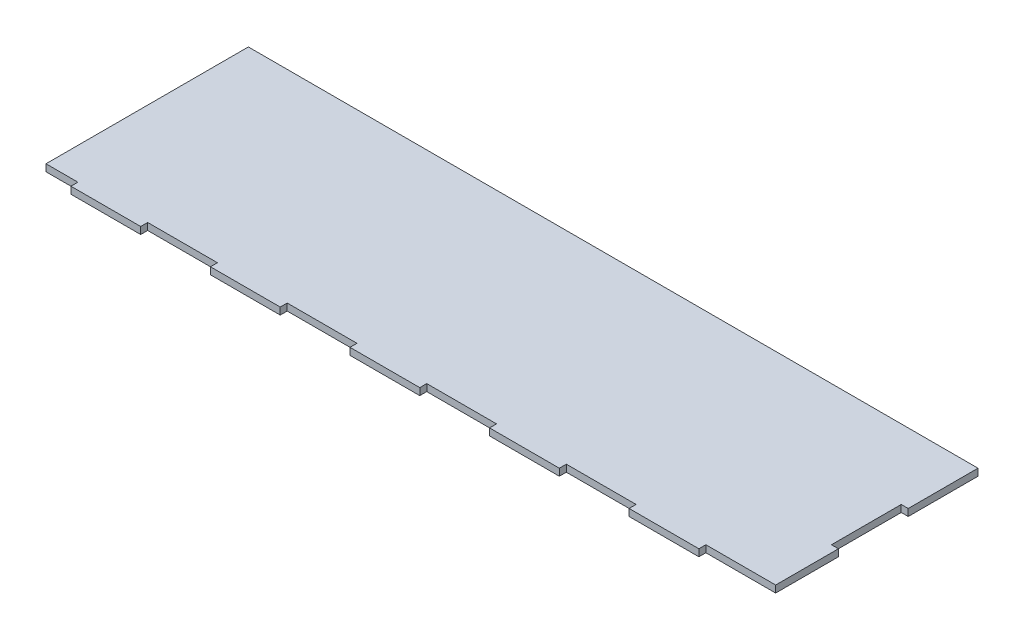
ISO-10303-21;
HEADER;
FILE_DESCRIPTION(('STEP AP214'),'2;1');
FILE_NAME('part.step','',(''),(''),'','','');
FILE_SCHEMA(('AUTOMOTIVE_DESIGN { 1 0 10303 214 1 1 1 1 }'));
ENDSEC;
DATA;
#1=APPLICATION_CONTEXT('core data for automotive mechanical design processes');
#2=APPLICATION_PROTOCOL_DEFINITION('international standard','automotive_design',2000,#1);
#3=PRODUCT_CONTEXT('',#1,'mechanical');
#4=PRODUCT('Part','Part','',(#3));
#5=PRODUCT_RELATED_PRODUCT_CATEGORY('part','',(#4));
#6=PRODUCT_DEFINITION_FORMATION('','',#4);
#7=PRODUCT_DEFINITION_CONTEXT('part definition',#1,'design');
#8=PRODUCT_DEFINITION('design','',#6,#7);
#9=PRODUCT_DEFINITION_SHAPE('','',#8);
#10=(LENGTH_UNIT() NAMED_UNIT(*) SI_UNIT(.MILLI.,.METRE.));
#11=(NAMED_UNIT(*) PLANE_ANGLE_UNIT() SI_UNIT($,.RADIAN.));
#12=(NAMED_UNIT(*) SI_UNIT($,.STERADIAN.) SOLID_ANGLE_UNIT());
#13=UNCERTAINTY_MEASURE_WITH_UNIT(LENGTH_MEASURE(1.E-05),#10,'distance_accuracy_value','');
#14=(GEOMETRIC_REPRESENTATION_CONTEXT(3) GLOBAL_UNCERTAINTY_ASSIGNED_CONTEXT((#13)) GLOBAL_UNIT_ASSIGNED_CONTEXT((#10,
#11,#12)) REPRESENTATION_CONTEXT('',''));
#15=CARTESIAN_POINT('',(0.,0.,0.));
#16=DIRECTION('',(0.,0.,1.));
#17=DIRECTION('',(1.,0.,0.));
#18=AXIS2_PLACEMENT_3D('',#15,#16,#17);
#19=CARTESIAN_POINT('',(1.29499999999999,0.,0.));
#20=DIRECTION('',(-1.,0.,0.));
#21=DIRECTION('',(0.,0.,1.));
#22=AXIS2_PLACEMENT_3D('',#19,#20,#21);
#23=PLANE('',#22);
#24=DIRECTION('',(0.,0.,-1.));
#25=VECTOR('',#24,1.);
#26=CARTESIAN_POINT('',(1.29499999999999,3.,0.));
#27=LINE('',#26,#25);
#28=CARTESIAN_POINT('',(1.29499999999999,3.,42.));
#29=VERTEX_POINT('',#28);
#30=CARTESIAN_POINT('',(1.29499999999999,3.,-45.));
#31=VERTEX_POINT('',#30);
#32=EDGE_CURVE('E238',#29,#31,#27,.T.);
#33=ORIENTED_EDGE('',*,*,#32,.T.);
#34=DIRECTION('',(0.,-1.,0.));
#35=VECTOR('',#34,1.);
#36=CARTESIAN_POINT('',(1.29499999999999,3.,-45.));
#37=LINE('',#36,#35);
#38=CARTESIAN_POINT('',(1.29499999999999,0.,-45.));
#39=VERTEX_POINT('',#38);
#40=EDGE_CURVE('E54',#31,#39,#37,.T.);
#41=ORIENTED_EDGE('',*,*,#40,.T.);
#42=DIRECTION('',(0.,0.,-1.));
#43=VECTOR('',#42,1.);
#44=CARTESIAN_POINT('',(1.29499999999999,0.,0.));
#45=LINE('',#44,#43);
#46=CARTESIAN_POINT('',(1.29499999999999,0.,42.));
#47=VERTEX_POINT('',#46);
#48=EDGE_CURVE('E62',#47,#39,#45,.T.);
#49=ORIENTED_EDGE('',*,*,#48,.F.);
#50=DIRECTION('',(0.,1.,0.));
#51=VECTOR('',#50,1.);
#52=CARTESIAN_POINT('',(1.29499999999999,0.,42.));
#53=LINE('',#52,#51);
#54=EDGE_CURVE('E12',#47,#29,#53,.T.);
#55=ORIENTED_EDGE('',*,*,#54,.T.);
#56=EDGE_LOOP('',(#33,#41,#49,#55));
#57=FACE_BOUND('',#56,.T.);
#58=ADVANCED_FACE('F39',(#57),#23,.T.);
#59=CARTESIAN_POINT('',(-315.,3.,-45.));
#60=DIRECTION('',(0.,0.,1.));
#61=DIRECTION('',(1.,0.,0.));
#62=AXIS2_PLACEMENT_3D('',#59,#60,#61);
#63=PLANE('',#62);
#64=ORIENTED_EDGE('',*,*,#40,.F.);
#65=DIRECTION('',(-1.,0.,0.));
#66=VECTOR('',#65,1.);
#67=CARTESIAN_POINT('',(-315.,3.,-45.));
#68=LINE('',#67,#66);
#69=CARTESIAN_POINT('',(315.,3.,-45.));
#70=VERTEX_POINT('',#69);
#71=EDGE_CURVE('E240',#70,#31,#68,.T.);
#72=ORIENTED_EDGE('',*,*,#71,.F.);
#73=DIRECTION('',(0.,-1.,0.));
#74=VECTOR('',#73,1.);
#75=CARTESIAN_POINT('',(315.,3.,-45.));
#76=LINE('',#75,#74);
#77=CARTESIAN_POINT('',(315.,0.,-45.));
#78=VERTEX_POINT('',#77);
#79=EDGE_CURVE('E414',#70,#78,#76,.T.);
#80=ORIENTED_EDGE('',*,*,#79,.T.);
#81=DIRECTION('',(-1.,0.,0.));
#82=VECTOR('',#81,1.);
#83=CARTESIAN_POINT('',(-315.,0.,-45.));
#84=LINE('',#83,#82);
#85=EDGE_CURVE('E407',#78,#39,#84,.T.);
#86=ORIENTED_EDGE('',*,*,#85,.T.);
#87=EDGE_LOOP('',(#64,#72,#80,#86));
#88=FACE_BOUND('',#87,.T.);
#89=ADVANCED_FACE('F488',(#88),#63,.F.);
#90=CARTESIAN_POINT('',(0.,3.,0.));
#91=DIRECTION('',(0.,-1.,0.));
#92=DIRECTION('',(0.,0.,-1.));
#93=AXIS2_PLACEMENT_3D('',#90,#91,#92);
#94=PLANE('',#93);
#95=ORIENTED_EDGE('',*,*,#32,.F.);
#96=DIRECTION('',(-1.,0.,0.));
#97=VECTOR('',#96,1.);
#98=CARTESIAN_POINT('',(-15.,3.,42.));
#99=LINE('',#98,#97);
#100=CARTESIAN_POINT('',(15.,3.,42.));
#101=VERTEX_POINT('',#100);
#102=EDGE_CURVE('E226',#101,#29,#99,.T.);
#103=ORIENTED_EDGE('',*,*,#102,.F.);
#104=DIRECTION('',(0.,0.,-1.));
#105=VECTOR('',#104,1.);
#106=CARTESIAN_POINT('',(15.,3.,45.));
#107=LINE('',#106,#105);
#108=CARTESIAN_POINT('',(15.,3.,45.));
#109=VERTEX_POINT('',#108);
#110=EDGE_CURVE('E235',#109,#101,#107,.T.);
#111=ORIENTED_EDGE('',*,*,#110,.F.);
#112=DIRECTION('',(1.,0.,0.));
#113=VECTOR('',#112,1.);
#114=CARTESIAN_POINT('',(-315.,3.,45.));
#115=LINE('',#114,#113);
#116=CARTESIAN_POINT('',(45.,3.,45.));
#117=VERTEX_POINT('',#116);
#118=EDGE_CURVE('E403',#109,#117,#115,.T.);
#119=ORIENTED_EDGE('',*,*,#118,.T.);
#120=DIRECTION('',(0.,0.,1.));
#121=VECTOR('',#120,1.);
#122=CARTESIAN_POINT('',(45.,3.,45.));
#123=LINE('',#122,#121);
#124=CARTESIAN_POINT('',(45.,3.,42.));
#125=VERTEX_POINT('',#124);
#126=EDGE_CURVE('E285',#125,#117,#123,.T.);
#127=ORIENTED_EDGE('',*,*,#126,.F.);
#128=DIRECTION('',(-1.,0.,0.));
#129=VECTOR('',#128,1.);
#130=CARTESIAN_POINT('',(45.,3.,42.));
#131=LINE('',#130,#129);
#132=CARTESIAN_POINT('',(75.,3.,42.));
#133=VERTEX_POINT('',#132);
#134=EDGE_CURVE('E278',#133,#125,#131,.T.);
#135=ORIENTED_EDGE('',*,*,#134,.F.);
#136=DIRECTION('',(0.,0.,-1.));
#137=VECTOR('',#136,1.);
#138=CARTESIAN_POINT('',(75.,3.,45.));
#139=LINE('',#138,#137);
#140=CARTESIAN_POINT('',(75.,3.,45.));
#141=VERTEX_POINT('',#140);
#142=EDGE_CURVE('E287',#141,#133,#139,.T.);
#143=ORIENTED_EDGE('',*,*,#142,.F.);
#144=CARTESIAN_POINT('',(105.,3.,45.));
#145=VERTEX_POINT('',#144);
#146=EDGE_CURVE('E754',#141,#145,#115,.T.);
#147=ORIENTED_EDGE('',*,*,#146,.T.);
#148=DIRECTION('',(0.,0.,1.));
#149=VECTOR('',#148,1.);
#150=CARTESIAN_POINT('',(105.,3.,45.));
#151=LINE('',#150,#149);
#152=CARTESIAN_POINT('',(105.,3.,42.));
#153=VERTEX_POINT('',#152);
#154=EDGE_CURVE('E311',#153,#145,#151,.T.);
#155=ORIENTED_EDGE('',*,*,#154,.F.);
#156=DIRECTION('',(-1.,0.,0.));
#157=VECTOR('',#156,1.);
#158=CARTESIAN_POINT('',(105.,3.,42.));
#159=LINE('',#158,#157);
#160=CARTESIAN_POINT('',(135.,3.,42.));
#161=VERTEX_POINT('',#160);
#162=EDGE_CURVE('E304',#161,#153,#159,.T.);
#163=ORIENTED_EDGE('',*,*,#162,.F.);
#164=DIRECTION('',(0.,0.,-1.));
#165=VECTOR('',#164,1.);
#166=CARTESIAN_POINT('',(135.,3.,45.));
#167=LINE('',#166,#165);
#168=CARTESIAN_POINT('',(135.,3.,45.));
#169=VERTEX_POINT('',#168);
#170=EDGE_CURVE('E313',#169,#161,#167,.T.);
#171=ORIENTED_EDGE('',*,*,#170,.F.);
#172=CARTESIAN_POINT('',(165.,3.,45.));
#173=VERTEX_POINT('',#172);
#174=EDGE_CURVE('E751',#169,#173,#115,.T.);
#175=ORIENTED_EDGE('',*,*,#174,.T.);
#176=DIRECTION('',(0.,0.,1.));
#177=VECTOR('',#176,1.);
#178=CARTESIAN_POINT('',(165.,3.,45.));
#179=LINE('',#178,#177);
#180=CARTESIAN_POINT('',(165.,3.,42.));
#181=VERTEX_POINT('',#180);
#182=EDGE_CURVE('E337',#181,#173,#179,.T.);
#183=ORIENTED_EDGE('',*,*,#182,.F.);
#184=DIRECTION('',(-1.,0.,0.));
#185=VECTOR('',#184,1.);
#186=CARTESIAN_POINT('',(165.,3.,42.));
#187=LINE('',#186,#185);
#188=CARTESIAN_POINT('',(195.,3.,42.));
#189=VERTEX_POINT('',#188);
#190=EDGE_CURVE('E330',#189,#181,#187,.T.);
#191=ORIENTED_EDGE('',*,*,#190,.F.);
#192=DIRECTION('',(0.,0.,-1.));
#193=VECTOR('',#192,1.);
#194=CARTESIAN_POINT('',(195.,3.,45.));
#195=LINE('',#194,#193);
#196=CARTESIAN_POINT('',(195.,3.,45.));
#197=VERTEX_POINT('',#196);
#198=EDGE_CURVE('E339',#197,#189,#195,.T.);
#199=ORIENTED_EDGE('',*,*,#198,.F.);
#200=CARTESIAN_POINT('',(225.,3.,45.));
#201=VERTEX_POINT('',#200);
#202=EDGE_CURVE('E402',#197,#201,#115,.T.);
#203=ORIENTED_EDGE('',*,*,#202,.T.);
#204=DIRECTION('',(0.,0.,1.));
#205=VECTOR('',#204,1.);
#206=CARTESIAN_POINT('',(225.,3.,45.));
#207=LINE('',#206,#205);
#208=CARTESIAN_POINT('',(225.,3.,42.));
#209=VERTEX_POINT('',#208);
#210=EDGE_CURVE('E363',#209,#201,#207,.T.);
#211=ORIENTED_EDGE('',*,*,#210,.F.);
#212=DIRECTION('',(-1.,0.,0.));
#213=VECTOR('',#212,1.);
#214=CARTESIAN_POINT('',(225.,3.,42.));
#215=LINE('',#214,#213);
#216=CARTESIAN_POINT('',(255.,3.,42.));
#217=VERTEX_POINT('',#216);
#218=EDGE_CURVE('E356',#217,#209,#215,.T.);
#219=ORIENTED_EDGE('',*,*,#218,.F.);
#220=DIRECTION('',(0.,0.,-1.));
#221=VECTOR('',#220,1.);
#222=CARTESIAN_POINT('',(255.,3.,45.));
#223=LINE('',#222,#221);
#224=CARTESIAN_POINT('',(255.,3.,45.));
#225=VERTEX_POINT('',#224);
#226=EDGE_CURVE('E365',#225,#217,#223,.T.);
#227=ORIENTED_EDGE('',*,*,#226,.F.);
#228=CARTESIAN_POINT('',(285.,3.,45.));
#229=VERTEX_POINT('',#228);
#230=EDGE_CURVE('E399',#225,#229,#115,.T.);
#231=ORIENTED_EDGE('',*,*,#230,.T.);
#232=DIRECTION('',(0.,0.,1.));
#233=VECTOR('',#232,1.);
#234=CARTESIAN_POINT('',(285.,3.,45.));
#235=LINE('',#234,#233);
#236=CARTESIAN_POINT('',(285.,3.,42.));
#237=VERTEX_POINT('',#236);
#238=EDGE_CURVE('E261',#237,#229,#235,.T.);
#239=ORIENTED_EDGE('',*,*,#238,.F.);
#240=DIRECTION('',(-1.,0.,0.));
#241=VECTOR('',#240,1.);
#242=CARTESIAN_POINT('',(285.,3.,42.));
#243=LINE('',#242,#241);
#244=CARTESIAN_POINT('',(315.,3.,42.));
#245=VERTEX_POINT('',#244);
#246=EDGE_CURVE('E382',#245,#237,#243,.T.);
#247=ORIENTED_EDGE('',*,*,#246,.F.);
#248=DIRECTION('',(0.,0.,-1.));
#249=VECTOR('',#248,1.);
#250=CARTESIAN_POINT('',(315.,3.,45.));
#251=LINE('',#250,#249);
#252=CARTESIAN_POINT('',(315.,3.,14.9999999985429));
#253=VERTEX_POINT('',#252);
#254=EDGE_CURVE('E394',#245,#253,#251,.T.);
#255=ORIENTED_EDGE('',*,*,#254,.T.);
#256=DIRECTION('',(-1.,0.,0.));
#257=VECTOR('',#256,1.);
#258=CARTESIAN_POINT('',(312.,3.,14.9999999985429));
#259=LINE('',#258,#257);
#260=CARTESIAN_POINT('',(312.,3.,14.9999999985429));
#261=VERTEX_POINT('',#260);
#262=EDGE_CURVE('E247',#253,#261,#259,.T.);
#263=ORIENTED_EDGE('',*,*,#262,.T.);
#264=DIRECTION('',(0.,0.,-1.));
#265=VECTOR('',#264,1.);
#266=CARTESIAN_POINT('',(312.,3.,14.9999999985429));
#267=LINE('',#266,#265);
#268=CARTESIAN_POINT('',(312.,3.,-15.0000000014571));
#269=VERTEX_POINT('',#268);
#270=EDGE_CURVE('E250',#261,#269,#267,.T.);
#271=ORIENTED_EDGE('',*,*,#270,.T.);
#272=DIRECTION('',(1.,0.,0.));
#273=VECTOR('',#272,1.);
#274=CARTESIAN_POINT('',(312.,3.,-15.0000000014571));
#275=LINE('',#274,#273);
#276=CARTESIAN_POINT('',(315.,3.,-15.0000000014571));
#277=VERTEX_POINT('',#276);
#278=EDGE_CURVE('E253',#269,#277,#275,.T.);
#279=ORIENTED_EDGE('',*,*,#278,.T.);
#280=EDGE_CURVE('E397',#277,#70,#251,.T.);
#281=ORIENTED_EDGE('',*,*,#280,.T.);
#282=ORIENTED_EDGE('',*,*,#71,.T.);
#283=EDGE_LOOP('',(#95,#103,#111,#119,#127,#135,#143,#147,#155,#163,#171,#175,#183,#191,#199,
#203,#211,#219,#227,#231,#239,#247,#255,#263,#271,#279,#281,#282));
#284=FACE_BOUND('',#283,.T.);
#285=ADVANCED_FACE('F239',(#284),#94,.F.);
#286=CARTESIAN_POINT('',(0.,0.,0.));
#287=DIRECTION('',(0.,-1.,0.));
#288=DIRECTION('',(0.,0.,-1.));
#289=AXIS2_PLACEMENT_3D('',#286,#287,#288);
#290=PLANE('',#289);
#291=DIRECTION('',(-1.,0.,0.));
#292=VECTOR('',#291,1.);
#293=CARTESIAN_POINT('',(-15.,0.,42.));
#294=LINE('',#293,#292);
#295=CARTESIAN_POINT('',(15.,0.,42.));
#296=VERTEX_POINT('',#295);
#297=EDGE_CURVE('E266',#296,#47,#294,.T.);
#298=ORIENTED_EDGE('',*,*,#297,.T.);
#299=ORIENTED_EDGE('',*,*,#48,.T.);
#300=ORIENTED_EDGE('',*,*,#85,.F.);
#301=DIRECTION('',(0.,0.,-1.));
#302=VECTOR('',#301,1.);
#303=CARTESIAN_POINT('',(315.,0.,45.));
#304=LINE('',#303,#302);
#305=CARTESIAN_POINT('',(315.,0.,-15.0000000014571));
#306=VERTEX_POINT('',#305);
#307=EDGE_CURVE('E272',#306,#78,#304,.T.);
#308=ORIENTED_EDGE('',*,*,#307,.F.);
#309=DIRECTION('',(1.,0.,0.));
#310=VECTOR('',#309,1.);
#311=CARTESIAN_POINT('',(0.,0.,-15.0000000014569));
#312=LINE('',#311,#310);
#313=CARTESIAN_POINT('',(312.,0.,-15.0000000014571));
#314=VERTEX_POINT('',#313);
#315=EDGE_CURVE('E47',#314,#306,#312,.T.);
#316=ORIENTED_EDGE('',*,*,#315,.F.);
#317=DIRECTION('',(0.,0.,-1.));
#318=VECTOR('',#317,1.);
#319=CARTESIAN_POINT('',(312.,0.,0.));
#320=LINE('',#319,#318);
#321=CARTESIAN_POINT('',(312.,0.,14.9999999985429));
#322=VERTEX_POINT('',#321);
#323=EDGE_CURVE('E420',#322,#314,#320,.T.);
#324=ORIENTED_EDGE('',*,*,#323,.F.);
#325=DIRECTION('',(-1.,0.,0.));
#326=VECTOR('',#325,1.);
#327=CARTESIAN_POINT('',(0.,0.,14.9999999985429));
#328=LINE('',#327,#326);
#329=CARTESIAN_POINT('',(315.,0.,14.9999999985429));
#330=VERTEX_POINT('',#329);
#331=EDGE_CURVE('E417',#330,#322,#328,.T.);
#332=ORIENTED_EDGE('',*,*,#331,.F.);
#333=CARTESIAN_POINT('',(315.,0.,42.));
#334=VERTEX_POINT('',#333);
#335=EDGE_CURVE('E404',#334,#330,#304,.T.);
#336=ORIENTED_EDGE('',*,*,#335,.F.);
#337=DIRECTION('',(-1.,0.,0.));
#338=VECTOR('',#337,1.);
#339=CARTESIAN_POINT('',(285.,0.,42.));
#340=LINE('',#339,#338);
#341=CARTESIAN_POINT('',(285.,0.,42.));
#342=VERTEX_POINT('',#341);
#343=EDGE_CURVE('E381',#334,#342,#340,.T.);
#344=ORIENTED_EDGE('',*,*,#343,.T.);
#345=DIRECTION('',(0.,0.,1.));
#346=VECTOR('',#345,1.);
#347=CARTESIAN_POINT('',(285.,0.,45.));
#348=LINE('',#347,#346);
#349=CARTESIAN_POINT('',(285.,0.,45.));
#350=VERTEX_POINT('',#349);
#351=EDGE_CURVE('E378',#342,#350,#348,.T.);
#352=ORIENTED_EDGE('',*,*,#351,.T.);
#353=DIRECTION('',(1.,0.,0.));
#354=VECTOR('',#353,1.);
#355=CARTESIAN_POINT('',(-315.,0.,45.));
#356=LINE('',#355,#354);
#357=CARTESIAN_POINT('',(255.,0.,45.));
#358=VERTEX_POINT('',#357);
#359=EDGE_CURVE('E409',#358,#350,#356,.T.);
#360=ORIENTED_EDGE('',*,*,#359,.F.);
#361=DIRECTION('',(0.,0.,-1.));
#362=VECTOR('',#361,1.);
#363=CARTESIAN_POINT('',(255.,0.,45.));
#364=LINE('',#363,#362);
#365=CARTESIAN_POINT('',(255.,0.,42.));
#366=VERTEX_POINT('',#365);
#367=EDGE_CURVE('E355',#358,#366,#364,.T.);
#368=ORIENTED_EDGE('',*,*,#367,.T.);
#369=DIRECTION('',(-1.,0.,0.));
#370=VECTOR('',#369,1.);
#371=CARTESIAN_POINT('',(225.,0.,42.));
#372=LINE('',#371,#370);
#373=CARTESIAN_POINT('',(225.,0.,42.));
#374=VERTEX_POINT('',#373);
#375=EDGE_CURVE('E359',#366,#374,#372,.T.);
#376=ORIENTED_EDGE('',*,*,#375,.T.);
#377=DIRECTION('',(0.,0.,1.));
#378=VECTOR('',#377,1.);
#379=CARTESIAN_POINT('',(225.,0.,45.));
#380=LINE('',#379,#378);
#381=CARTESIAN_POINT('',(225.,0.,45.));
#382=VERTEX_POINT('',#381);
#383=EDGE_CURVE('E352',#374,#382,#380,.T.);
#384=ORIENTED_EDGE('',*,*,#383,.T.);
#385=CARTESIAN_POINT('',(195.,0.,45.));
#386=VERTEX_POINT('',#385);
#387=EDGE_CURVE('E412',#386,#382,#356,.T.);
#388=ORIENTED_EDGE('',*,*,#387,.F.);
#389=DIRECTION('',(0.,0.,-1.));
#390=VECTOR('',#389,1.);
#391=CARTESIAN_POINT('',(195.,0.,45.));
#392=LINE('',#391,#390);
#393=CARTESIAN_POINT('',(195.,0.,42.));
#394=VERTEX_POINT('',#393);
#395=EDGE_CURVE('E329',#386,#394,#392,.T.);
#396=ORIENTED_EDGE('',*,*,#395,.T.);
#397=DIRECTION('',(-1.,0.,0.));
#398=VECTOR('',#397,1.);
#399=CARTESIAN_POINT('',(165.,0.,42.));
#400=LINE('',#399,#398);
#401=CARTESIAN_POINT('',(165.,0.,42.));
#402=VERTEX_POINT('',#401);
#403=EDGE_CURVE('E333',#394,#402,#400,.T.);
#404=ORIENTED_EDGE('',*,*,#403,.T.);
#405=DIRECTION('',(0.,0.,1.));
#406=VECTOR('',#405,1.);
#407=CARTESIAN_POINT('',(165.,0.,45.));
#408=LINE('',#407,#406);
#409=CARTESIAN_POINT('',(165.,0.,45.));
#410=VERTEX_POINT('',#409);
#411=EDGE_CURVE('E326',#402,#410,#408,.T.);
#412=ORIENTED_EDGE('',*,*,#411,.T.);
#413=CARTESIAN_POINT('',(135.,0.,45.));
#414=VERTEX_POINT('',#413);
#415=EDGE_CURVE('E471',#414,#410,#356,.T.);
#416=ORIENTED_EDGE('',*,*,#415,.F.);
#417=DIRECTION('',(0.,0.,-1.));
#418=VECTOR('',#417,1.);
#419=CARTESIAN_POINT('',(135.,0.,45.));
#420=LINE('',#419,#418);
#421=CARTESIAN_POINT('',(135.,0.,42.));
#422=VERTEX_POINT('',#421);
#423=EDGE_CURVE('E303',#414,#422,#420,.T.);
#424=ORIENTED_EDGE('',*,*,#423,.T.);
#425=DIRECTION('',(-1.,0.,0.));
#426=VECTOR('',#425,1.);
#427=CARTESIAN_POINT('',(105.,0.,42.));
#428=LINE('',#427,#426);
#429=CARTESIAN_POINT('',(105.,0.,42.));
#430=VERTEX_POINT('',#429);
#431=EDGE_CURVE('E307',#422,#430,#428,.T.);
#432=ORIENTED_EDGE('',*,*,#431,.T.);
#433=DIRECTION('',(0.,0.,1.));
#434=VECTOR('',#433,1.);
#435=CARTESIAN_POINT('',(105.,0.,45.));
#436=LINE('',#435,#434);
#437=CARTESIAN_POINT('',(105.,0.,45.));
#438=VERTEX_POINT('',#437);
#439=EDGE_CURVE('E300',#430,#438,#436,.T.);
#440=ORIENTED_EDGE('',*,*,#439,.T.);
#441=CARTESIAN_POINT('',(75.,0.,45.));
#442=VERTEX_POINT('',#441);
#443=EDGE_CURVE('E473',#442,#438,#356,.T.);
#444=ORIENTED_EDGE('',*,*,#443,.F.);
#445=DIRECTION('',(0.,0.,-1.));
#446=VECTOR('',#445,1.);
#447=CARTESIAN_POINT('',(75.,0.,45.));
#448=LINE('',#447,#446);
#449=CARTESIAN_POINT('',(75.,0.,42.));
#450=VERTEX_POINT('',#449);
#451=EDGE_CURVE('E277',#442,#450,#448,.T.);
#452=ORIENTED_EDGE('',*,*,#451,.T.);
#453=DIRECTION('',(-1.,0.,0.));
#454=VECTOR('',#453,1.);
#455=CARTESIAN_POINT('',(45.,0.,42.));
#456=LINE('',#455,#454);
#457=CARTESIAN_POINT('',(45.,0.,42.));
#458=VERTEX_POINT('',#457);
#459=EDGE_CURVE('E281',#450,#458,#456,.T.);
#460=ORIENTED_EDGE('',*,*,#459,.T.);
#461=DIRECTION('',(0.,0.,1.));
#462=VECTOR('',#461,1.);
#463=CARTESIAN_POINT('',(45.,0.,45.));
#464=LINE('',#463,#462);
#465=CARTESIAN_POINT('',(45.,0.,45.));
#466=VERTEX_POINT('',#465);
#467=EDGE_CURVE('E274',#458,#466,#464,.T.);
#468=ORIENTED_EDGE('',*,*,#467,.T.);
#469=CARTESIAN_POINT('',(15.,0.,45.));
#470=VERTEX_POINT('',#469);
#471=EDGE_CURVE('E413',#470,#466,#356,.T.);
#472=ORIENTED_EDGE('',*,*,#471,.F.);
#473=DIRECTION('',(0.,0.,-1.));
#474=VECTOR('',#473,1.);
#475=CARTESIAN_POINT('',(15.,0.,45.));
#476=LINE('',#475,#474);
#477=EDGE_CURVE('E234',#470,#296,#476,.T.);
#478=ORIENTED_EDGE('',*,*,#477,.T.);
#479=EDGE_LOOP('',(#298,#299,#300,#308,#316,#324,#332,#336,#344,#352,#360,#368,#376,#384,#388,
#396,#404,#412,#416,#424,#432,#440,#444,#452,#460,#468,#472,#478));
#480=FACE_BOUND('',#479,.T.);
#481=ADVANCED_FACE('F429',(#480),#290,.T.);
#482=CARTESIAN_POINT('',(-15.,0.,42.));
#483=DIRECTION('',(0.,0.,-1.));
#484=DIRECTION('',(-1.,0.,0.));
#485=AXIS2_PLACEMENT_3D('',#482,#483,#484);
#486=PLANE('',#485);
#487=ORIENTED_EDGE('',*,*,#54,.F.);
#488=ORIENTED_EDGE('',*,*,#297,.F.);
#489=DIRECTION('',(0.,1.,0.));
#490=VECTOR('',#489,1.);
#491=CARTESIAN_POINT('',(15.,0.,42.));
#492=LINE('',#491,#490);
#493=EDGE_CURVE('E230',#296,#101,#492,.T.);
#494=ORIENTED_EDGE('',*,*,#493,.T.);
#495=ORIENTED_EDGE('',*,*,#102,.T.);
#496=EDGE_LOOP('',(#487,#488,#494,#495));
#497=FACE_BOUND('',#496,.T.);
#498=ADVANCED_FACE('F228',(#497),#486,.F.);
#499=CARTESIAN_POINT('',(315.,3.,45.));
#500=DIRECTION('',(-1.,0.,0.));
#501=DIRECTION('',(0.,0.,1.));
#502=AXIS2_PLACEMENT_3D('',#499,#500,#501);
#503=PLANE('',#502);
#504=ORIENTED_EDGE('',*,*,#280,.F.);
#505=DIRECTION('',(0.,-1.,0.));
#506=VECTOR('',#505,1.);
#507=CARTESIAN_POINT('',(315.,3.,-15.0000000014571));
#508=LINE('',#507,#506);
#509=EDGE_CURVE('E255',#277,#306,#508,.T.);
#510=ORIENTED_EDGE('',*,*,#509,.T.);
#511=ORIENTED_EDGE('',*,*,#307,.T.);
#512=ORIENTED_EDGE('',*,*,#79,.F.);
#513=EDGE_LOOP('',(#504,#510,#511,#512));
#514=FACE_BOUND('',#513,.T.);
#515=ADVANCED_FACE('F489',(#514),#503,.F.);
#516=CARTESIAN_POINT('',(-315.,3.,45.));
#517=DIRECTION('',(0.,0.,-1.));
#518=DIRECTION('',(-1.,0.,0.));
#519=AXIS2_PLACEMENT_3D('',#516,#517,#518);
#520=PLANE('',#519);
#521=ORIENTED_EDGE('',*,*,#387,.T.);
#522=DIRECTION('',(0.,1.,0.));
#523=VECTOR('',#522,1.);
#524=CARTESIAN_POINT('',(225.,0.,45.));
#525=LINE('',#524,#523);
#526=EDGE_CURVE('E362',#382,#201,#525,.T.);
#527=ORIENTED_EDGE('',*,*,#526,.T.);
#528=ORIENTED_EDGE('',*,*,#202,.F.);
#529=DIRECTION('',(0.,1.,0.));
#530=VECTOR('',#529,1.);
#531=CARTESIAN_POINT('',(195.,0.,45.));
#532=LINE('',#531,#530);
#533=EDGE_CURVE('E348',#386,#197,#532,.T.);
#534=ORIENTED_EDGE('',*,*,#533,.F.);
#535=EDGE_LOOP('',(#521,#527,#528,#534));
#536=FACE_BOUND('',#535,.T.);
#537=ADVANCED_FACE('F468',(#536),#520,.F.);
#538=ORIENTED_EDGE('',*,*,#415,.T.);
#539=DIRECTION('',(0.,1.,0.));
#540=VECTOR('',#539,1.);
#541=CARTESIAN_POINT('',(165.,0.,45.));
#542=LINE('',#541,#540);
#543=EDGE_CURVE('E336',#410,#173,#542,.T.);
#544=ORIENTED_EDGE('',*,*,#543,.T.);
#545=ORIENTED_EDGE('',*,*,#174,.F.);
#546=DIRECTION('',(0.,1.,0.));
#547=VECTOR('',#546,1.);
#548=CARTESIAN_POINT('',(135.,0.,45.));
#549=LINE('',#548,#547);
#550=EDGE_CURVE('E322',#414,#169,#549,.T.);
#551=ORIENTED_EDGE('',*,*,#550,.F.);
#552=EDGE_LOOP('',(#538,#544,#545,#551));
#553=FACE_BOUND('',#552,.T.);
#554=ADVANCED_FACE('F495',(#553),#520,.F.);
#555=ORIENTED_EDGE('',*,*,#443,.T.);
#556=DIRECTION('',(0.,1.,0.));
#557=VECTOR('',#556,1.);
#558=CARTESIAN_POINT('',(105.,0.,45.));
#559=LINE('',#558,#557);
#560=EDGE_CURVE('E310',#438,#145,#559,.T.);
#561=ORIENTED_EDGE('',*,*,#560,.T.);
#562=ORIENTED_EDGE('',*,*,#146,.F.);
#563=DIRECTION('',(0.,1.,0.));
#564=VECTOR('',#563,1.);
#565=CARTESIAN_POINT('',(75.,0.,45.));
#566=LINE('',#565,#564);
#567=EDGE_CURVE('E296',#442,#141,#566,.T.);
#568=ORIENTED_EDGE('',*,*,#567,.F.);
#569=EDGE_LOOP('',(#555,#561,#562,#568));
#570=FACE_BOUND('',#569,.T.);
#571=ADVANCED_FACE('F569',(#570),#520,.F.);
#572=ORIENTED_EDGE('',*,*,#471,.T.);
#573=DIRECTION('',(0.,1.,0.));
#574=VECTOR('',#573,1.);
#575=CARTESIAN_POINT('',(45.,0.,45.));
#576=LINE('',#575,#574);
#577=EDGE_CURVE('E284',#466,#117,#576,.T.);
#578=ORIENTED_EDGE('',*,*,#577,.T.);
#579=ORIENTED_EDGE('',*,*,#118,.F.);
#580=DIRECTION('',(0.,1.,0.));
#581=VECTOR('',#580,1.);
#582=CARTESIAN_POINT('',(15.,0.,45.));
#583=LINE('',#582,#581);
#584=EDGE_CURVE('E268',#470,#109,#583,.T.);
#585=ORIENTED_EDGE('',*,*,#584,.F.);
#586=EDGE_LOOP('',(#572,#578,#579,#585));
#587=FACE_BOUND('',#586,.T.);
#588=ADVANCED_FACE('F499',(#587),#520,.F.);
#589=ORIENTED_EDGE('',*,*,#335,.T.);
#590=DIRECTION('',(0.,-1.,0.));
#591=VECTOR('',#590,1.);
#592=CARTESIAN_POINT('',(315.,3.,14.9999999985429));
#593=LINE('',#592,#591);
#594=EDGE_CURVE('E246',#253,#330,#593,.T.);
#595=ORIENTED_EDGE('',*,*,#594,.F.);
#596=ORIENTED_EDGE('',*,*,#254,.F.);
#597=DIRECTION('',(0.,1.,0.));
#598=VECTOR('',#597,1.);
#599=CARTESIAN_POINT('',(315.,0.,42.));
#600=LINE('',#599,#598);
#601=EDGE_CURVE('E390',#334,#245,#600,.T.);
#602=ORIENTED_EDGE('',*,*,#601,.F.);
#603=EDGE_LOOP('',(#589,#595,#596,#602));
#604=FACE_BOUND('',#603,.T.);
#605=ADVANCED_FACE('F41',(#604),#503,.F.);
#606=ORIENTED_EDGE('',*,*,#359,.T.);
#607=DIRECTION('',(0.,1.,0.));
#608=VECTOR('',#607,1.);
#609=CARTESIAN_POINT('',(285.,0.,45.));
#610=LINE('',#609,#608);
#611=EDGE_CURVE('E385',#350,#229,#610,.T.);
#612=ORIENTED_EDGE('',*,*,#611,.T.);
#613=ORIENTED_EDGE('',*,*,#230,.F.);
#614=DIRECTION('',(0.,1.,0.));
#615=VECTOR('',#614,1.);
#616=CARTESIAN_POINT('',(255.,0.,45.));
#617=LINE('',#616,#615);
#618=EDGE_CURVE('E374',#358,#225,#617,.T.);
#619=ORIENTED_EDGE('',*,*,#618,.F.);
#620=EDGE_LOOP('',(#606,#612,#613,#619));
#621=FACE_BOUND('',#620,.T.);
#622=ADVANCED_FACE('F451',(#621),#520,.F.);
#623=CARTESIAN_POINT('',(15.,0.,45.));
#624=DIRECTION('',(1.,0.,0.));
#625=DIRECTION('',(0.,0.,-1.));
#626=AXIS2_PLACEMENT_3D('',#623,#624,#625);
#627=PLANE('',#626);
#628=ORIENTED_EDGE('',*,*,#110,.T.);
#629=ORIENTED_EDGE('',*,*,#493,.F.);
#630=ORIENTED_EDGE('',*,*,#477,.F.);
#631=ORIENTED_EDGE('',*,*,#584,.T.);
#632=EDGE_LOOP('',(#628,#629,#630,#631));
#633=FACE_BOUND('',#632,.T.);
#634=ADVANCED_FACE('F512',(#633),#627,.F.);
#635=CARTESIAN_POINT('',(45.,0.,45.));
#636=DIRECTION('',(-1.,0.,0.));
#637=DIRECTION('',(0.,0.,1.));
#638=AXIS2_PLACEMENT_3D('',#635,#636,#637);
#639=PLANE('',#638);
#640=ORIENTED_EDGE('',*,*,#126,.T.);
#641=ORIENTED_EDGE('',*,*,#577,.F.);
#642=ORIENTED_EDGE('',*,*,#467,.F.);
#643=DIRECTION('',(0.,1.,0.));
#644=VECTOR('',#643,1.);
#645=CARTESIAN_POINT('',(45.,0.,42.));
#646=LINE('',#645,#644);
#647=EDGE_CURVE('E269',#458,#125,#646,.T.);
#648=ORIENTED_EDGE('',*,*,#647,.T.);
#649=EDGE_LOOP('',(#640,#641,#642,#648));
#650=FACE_BOUND('',#649,.T.);
#651=ADVANCED_FACE('F515',(#650),#639,.F.);
#652=CARTESIAN_POINT('',(45.,0.,42.));
#653=DIRECTION('',(0.,0.,-1.));
#654=DIRECTION('',(-1.,0.,0.));
#655=AXIS2_PLACEMENT_3D('',#652,#653,#654);
#656=PLANE('',#655);
#657=ORIENTED_EDGE('',*,*,#134,.T.);
#658=ORIENTED_EDGE('',*,*,#647,.F.);
#659=ORIENTED_EDGE('',*,*,#459,.F.);
#660=DIRECTION('',(0.,1.,0.));
#661=VECTOR('',#660,1.);
#662=CARTESIAN_POINT('',(75.,0.,42.));
#663=LINE('',#662,#661);
#664=EDGE_CURVE('E294',#450,#133,#663,.T.);
#665=ORIENTED_EDGE('',*,*,#664,.T.);
#666=EDGE_LOOP('',(#657,#658,#659,#665));
#667=FACE_BOUND('',#666,.T.);
#668=ADVANCED_FACE('F517',(#667),#656,.F.);
#669=CARTESIAN_POINT('',(75.,0.,45.));
#670=DIRECTION('',(1.,0.,0.));
#671=DIRECTION('',(0.,0.,-1.));
#672=AXIS2_PLACEMENT_3D('',#669,#670,#671);
#673=PLANE('',#672);
#674=ORIENTED_EDGE('',*,*,#142,.T.);
#675=ORIENTED_EDGE('',*,*,#664,.F.);
#676=ORIENTED_EDGE('',*,*,#451,.F.);
#677=ORIENTED_EDGE('',*,*,#567,.T.);
#678=EDGE_LOOP('',(#674,#675,#676,#677));
#679=FACE_BOUND('',#678,.T.);
#680=ADVANCED_FACE('F520',(#679),#673,.F.);
#681=CARTESIAN_POINT('',(105.,0.,45.));
#682=DIRECTION('',(-1.,0.,0.));
#683=DIRECTION('',(0.,0.,1.));
#684=AXIS2_PLACEMENT_3D('',#681,#682,#683);
#685=PLANE('',#684);
#686=ORIENTED_EDGE('',*,*,#154,.T.);
#687=ORIENTED_EDGE('',*,*,#560,.F.);
#688=ORIENTED_EDGE('',*,*,#439,.F.);
#689=DIRECTION('',(0.,1.,0.));
#690=VECTOR('',#689,1.);
#691=CARTESIAN_POINT('',(105.,0.,42.));
#692=LINE('',#691,#690);
#693=EDGE_CURVE('E288',#430,#153,#692,.T.);
#694=ORIENTED_EDGE('',*,*,#693,.T.);
#695=EDGE_LOOP('',(#686,#687,#688,#694));
#696=FACE_BOUND('',#695,.T.);
#697=ADVANCED_FACE('F524',(#696),#685,.F.);
#698=CARTESIAN_POINT('',(105.,0.,42.));
#699=DIRECTION('',(0.,0.,-1.));
#700=DIRECTION('',(-1.,0.,0.));
#701=AXIS2_PLACEMENT_3D('',#698,#699,#700);
#702=PLANE('',#701);
#703=ORIENTED_EDGE('',*,*,#162,.T.);
#704=ORIENTED_EDGE('',*,*,#693,.F.);
#705=ORIENTED_EDGE('',*,*,#431,.F.);
#706=DIRECTION('',(0.,1.,0.));
#707=VECTOR('',#706,1.);
#708=CARTESIAN_POINT('',(135.,0.,42.));
#709=LINE('',#708,#707);
#710=EDGE_CURVE('E320',#422,#161,#709,.T.);
#711=ORIENTED_EDGE('',*,*,#710,.T.);
#712=EDGE_LOOP('',(#703,#704,#705,#711));
#713=FACE_BOUND('',#712,.T.);
#714=ADVANCED_FACE('F529',(#713),#702,.F.);
#715=CARTESIAN_POINT('',(135.,0.,45.));
#716=DIRECTION('',(1.,0.,0.));
#717=DIRECTION('',(0.,0.,-1.));
#718=AXIS2_PLACEMENT_3D('',#715,#716,#717);
#719=PLANE('',#718);
#720=ORIENTED_EDGE('',*,*,#170,.T.);
#721=ORIENTED_EDGE('',*,*,#710,.F.);
#722=ORIENTED_EDGE('',*,*,#423,.F.);
#723=ORIENTED_EDGE('',*,*,#550,.T.);
#724=EDGE_LOOP('',(#720,#721,#722,#723));
#725=FACE_BOUND('',#724,.T.);
#726=ADVANCED_FACE('F532',(#725),#719,.F.);
#727=CARTESIAN_POINT('',(165.,0.,45.));
#728=DIRECTION('',(-1.,0.,0.));
#729=DIRECTION('',(0.,0.,1.));
#730=AXIS2_PLACEMENT_3D('',#727,#728,#729);
#731=PLANE('',#730);
#732=ORIENTED_EDGE('',*,*,#182,.T.);
#733=ORIENTED_EDGE('',*,*,#543,.F.);
#734=ORIENTED_EDGE('',*,*,#411,.F.);
#735=DIRECTION('',(0.,1.,0.));
#736=VECTOR('',#735,1.);
#737=CARTESIAN_POINT('',(165.,0.,42.));
#738=LINE('',#737,#736);
#739=EDGE_CURVE('E314',#402,#181,#738,.T.);
#740=ORIENTED_EDGE('',*,*,#739,.T.);
#741=EDGE_LOOP('',(#732,#733,#734,#740));
#742=FACE_BOUND('',#741,.T.);
#743=ADVANCED_FACE('F536',(#742),#731,.F.);
#744=CARTESIAN_POINT('',(165.,0.,42.));
#745=DIRECTION('',(0.,0.,-1.));
#746=DIRECTION('',(-1.,0.,0.));
#747=AXIS2_PLACEMENT_3D('',#744,#745,#746);
#748=PLANE('',#747);
#749=ORIENTED_EDGE('',*,*,#190,.T.);
#750=ORIENTED_EDGE('',*,*,#739,.F.);
#751=ORIENTED_EDGE('',*,*,#403,.F.);
#752=DIRECTION('',(0.,1.,0.));
#753=VECTOR('',#752,1.);
#754=CARTESIAN_POINT('',(195.,0.,42.));
#755=LINE('',#754,#753);
#756=EDGE_CURVE('E346',#394,#189,#755,.T.);
#757=ORIENTED_EDGE('',*,*,#756,.T.);
#758=EDGE_LOOP('',(#749,#750,#751,#757));
#759=FACE_BOUND('',#758,.T.);
#760=ADVANCED_FACE('F541',(#759),#748,.F.);
#761=CARTESIAN_POINT('',(195.,0.,45.));
#762=DIRECTION('',(1.,0.,0.));
#763=DIRECTION('',(0.,0.,-1.));
#764=AXIS2_PLACEMENT_3D('',#761,#762,#763);
#765=PLANE('',#764);
#766=ORIENTED_EDGE('',*,*,#198,.T.);
#767=ORIENTED_EDGE('',*,*,#756,.F.);
#768=ORIENTED_EDGE('',*,*,#395,.F.);
#769=ORIENTED_EDGE('',*,*,#533,.T.);
#770=EDGE_LOOP('',(#766,#767,#768,#769));
#771=FACE_BOUND('',#770,.T.);
#772=ADVANCED_FACE('F544',(#771),#765,.F.);
#773=CARTESIAN_POINT('',(225.,0.,45.));
#774=DIRECTION('',(-1.,0.,0.));
#775=DIRECTION('',(0.,0.,1.));
#776=AXIS2_PLACEMENT_3D('',#773,#774,#775);
#777=PLANE('',#776);
#778=ORIENTED_EDGE('',*,*,#210,.T.);
#779=ORIENTED_EDGE('',*,*,#526,.F.);
#780=ORIENTED_EDGE('',*,*,#383,.F.);
#781=DIRECTION('',(0.,1.,0.));
#782=VECTOR('',#781,1.);
#783=CARTESIAN_POINT('',(225.,0.,42.));
#784=LINE('',#783,#782);
#785=EDGE_CURVE('E340',#374,#209,#784,.T.);
#786=ORIENTED_EDGE('',*,*,#785,.T.);
#787=EDGE_LOOP('',(#778,#779,#780,#786));
#788=FACE_BOUND('',#787,.T.);
#789=ADVANCED_FACE('F463',(#788),#777,.F.);
#790=CARTESIAN_POINT('',(225.,0.,42.));
#791=DIRECTION('',(0.,0.,-1.));
#792=DIRECTION('',(-1.,0.,0.));
#793=AXIS2_PLACEMENT_3D('',#790,#791,#792);
#794=PLANE('',#793);
#795=ORIENTED_EDGE('',*,*,#218,.T.);
#796=ORIENTED_EDGE('',*,*,#785,.F.);
#797=ORIENTED_EDGE('',*,*,#375,.F.);
#798=DIRECTION('',(0.,1.,0.));
#799=VECTOR('',#798,1.);
#800=CARTESIAN_POINT('',(255.,0.,42.));
#801=LINE('',#800,#799);
#802=EDGE_CURVE('E372',#366,#217,#801,.T.);
#803=ORIENTED_EDGE('',*,*,#802,.T.);
#804=EDGE_LOOP('',(#795,#796,#797,#803));
#805=FACE_BOUND('',#804,.T.);
#806=ADVANCED_FACE('F459',(#805),#794,.F.);
#807=CARTESIAN_POINT('',(255.,0.,45.));
#808=DIRECTION('',(1.,0.,0.));
#809=DIRECTION('',(0.,0.,-1.));
#810=AXIS2_PLACEMENT_3D('',#807,#808,#809);
#811=PLANE('',#810);
#812=ORIENTED_EDGE('',*,*,#226,.T.);
#813=ORIENTED_EDGE('',*,*,#802,.F.);
#814=ORIENTED_EDGE('',*,*,#367,.F.);
#815=ORIENTED_EDGE('',*,*,#618,.T.);
#816=EDGE_LOOP('',(#812,#813,#814,#815));
#817=FACE_BOUND('',#816,.T.);
#818=ADVANCED_FACE('F456',(#817),#811,.F.);
#819=CARTESIAN_POINT('',(285.,0.,45.));
#820=DIRECTION('',(-1.,0.,0.));
#821=DIRECTION('',(0.,0.,1.));
#822=AXIS2_PLACEMENT_3D('',#819,#820,#821);
#823=PLANE('',#822);
#824=ORIENTED_EDGE('',*,*,#238,.T.);
#825=ORIENTED_EDGE('',*,*,#611,.F.);
#826=ORIENTED_EDGE('',*,*,#351,.F.);
#827=DIRECTION('',(0.,1.,0.));
#828=VECTOR('',#827,1.);
#829=CARTESIAN_POINT('',(285.,0.,42.));
#830=LINE('',#829,#828);
#831=EDGE_CURVE('E366',#342,#237,#830,.T.);
#832=ORIENTED_EDGE('',*,*,#831,.T.);
#833=EDGE_LOOP('',(#824,#825,#826,#832));
#834=FACE_BOUND('',#833,.T.);
#835=ADVANCED_FACE('F449',(#834),#823,.F.);
#836=CARTESIAN_POINT('',(285.,0.,42.));
#837=DIRECTION('',(0.,0.,-1.));
#838=DIRECTION('',(-1.,0.,0.));
#839=AXIS2_PLACEMENT_3D('',#836,#837,#838);
#840=PLANE('',#839);
#841=ORIENTED_EDGE('',*,*,#246,.T.);
#842=ORIENTED_EDGE('',*,*,#831,.F.);
#843=ORIENTED_EDGE('',*,*,#343,.F.);
#844=ORIENTED_EDGE('',*,*,#601,.T.);
#845=EDGE_LOOP('',(#841,#842,#843,#844));
#846=FACE_BOUND('',#845,.T.);
#847=ADVANCED_FACE('F443',(#846),#840,.F.);
#848=CARTESIAN_POINT('',(312.,3.,-15.0000000014571));
#849=DIRECTION('',(0.,0.,-1.));
#850=DIRECTION('',(-1.,0.,0.));
#851=AXIS2_PLACEMENT_3D('',#848,#849,#850);
#852=PLANE('',#851);
#853=DIRECTION('',(0.,-1.,0.));
#854=VECTOR('',#853,1.);
#855=CARTESIAN_POINT('',(312.,3.,-15.0000000014571));
#856=LINE('',#855,#854);
#857=EDGE_CURVE('E252',#269,#314,#856,.T.);
#858=ORIENTED_EDGE('',*,*,#857,.T.);
#859=ORIENTED_EDGE('',*,*,#315,.T.);
#860=ORIENTED_EDGE('',*,*,#509,.F.);
#861=ORIENTED_EDGE('',*,*,#278,.F.);
#862=EDGE_LOOP('',(#858,#859,#860,#861));
#863=FACE_BOUND('',#862,.T.);
#864=ADVANCED_FACE('F425',(#863),#852,.F.);
#865=CARTESIAN_POINT('',(312.,3.,14.9999999985429));
#866=DIRECTION('',(-1.,0.,0.));
#867=DIRECTION('',(0.,0.,1.));
#868=AXIS2_PLACEMENT_3D('',#865,#866,#867);
#869=PLANE('',#868);
#870=DIRECTION('',(0.,-1.,0.));
#871=VECTOR('',#870,1.);
#872=CARTESIAN_POINT('',(312.,3.,14.9999999985429));
#873=LINE('',#872,#871);
#874=EDGE_CURVE('E249',#261,#322,#873,.T.);
#875=ORIENTED_EDGE('',*,*,#874,.T.);
#876=ORIENTED_EDGE('',*,*,#323,.T.);
#877=ORIENTED_EDGE('',*,*,#857,.F.);
#878=ORIENTED_EDGE('',*,*,#270,.F.);
#879=EDGE_LOOP('',(#875,#876,#877,#878));
#880=FACE_BOUND('',#879,.T.);
#881=ADVANCED_FACE('F431',(#880),#869,.F.);
#882=CARTESIAN_POINT('',(312.,3.,14.9999999985429));
#883=DIRECTION('',(0.,0.,1.));
#884=DIRECTION('',(1.,0.,0.));
#885=AXIS2_PLACEMENT_3D('',#882,#883,#884);
#886=PLANE('',#885);
#887=ORIENTED_EDGE('',*,*,#594,.T.);
#888=ORIENTED_EDGE('',*,*,#331,.T.);
#889=ORIENTED_EDGE('',*,*,#874,.F.);
#890=ORIENTED_EDGE('',*,*,#262,.F.);
#891=EDGE_LOOP('',(#887,#888,#889,#890));
#892=FACE_BOUND('',#891,.T.);
#893=ADVANCED_FACE('F436',(#892),#886,.F.);
#894=CLOSED_SHELL('',(#58,#89,#285,#481,#498,#515,#537,#554,#571,#588,#605,#622,#634,#651,#668,
#680,#697,#714,#726,#743,#760,#772,#789,#806,#818,#835,#847,#864,#881,#893));
#895=MANIFOLD_SOLID_BREP('B2',#894);
#896=ADVANCED_BREP_SHAPE_REPRESENTATION('',(#18,#895),#14);
#897=SHAPE_DEFINITION_REPRESENTATION(#9,#896);
ENDSEC;
END-ISO-10303-21;
